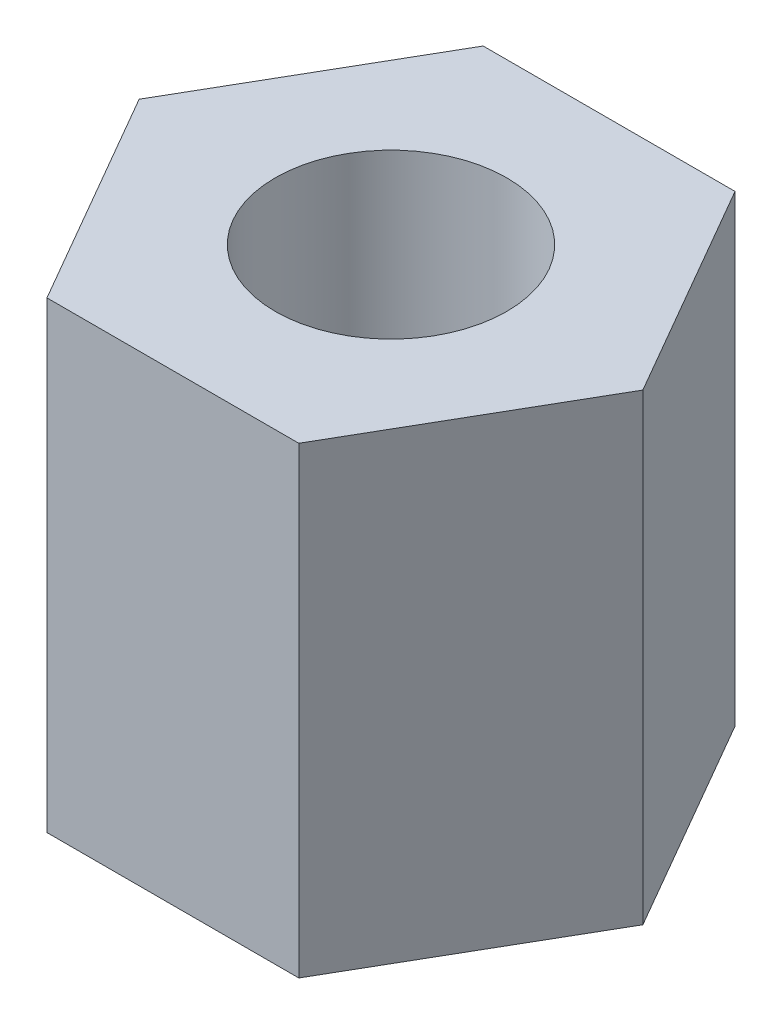
ISO-10303-21;
HEADER;
FILE_DESCRIPTION(('STEP AP214'),'2;1');
FILE_NAME('part.step','',(''),(''),'','','');
FILE_SCHEMA(('AUTOMOTIVE_DESIGN { 1 0 10303 214 1 1 1 1 }'));
ENDSEC;
DATA;
#1=APPLICATION_CONTEXT('core data for automotive mechanical design processes');
#2=APPLICATION_PROTOCOL_DEFINITION('international standard','automotive_design',2000,#1);
#3=PRODUCT_CONTEXT('',#1,'mechanical');
#4=PRODUCT('Part','Part','',(#3));
#5=PRODUCT_RELATED_PRODUCT_CATEGORY('part','',(#4));
#6=PRODUCT_DEFINITION_FORMATION('','',#4);
#7=PRODUCT_DEFINITION_CONTEXT('part definition',#1,'design');
#8=PRODUCT_DEFINITION('design','',#6,#7);
#9=PRODUCT_DEFINITION_SHAPE('','',#8);
#10=(LENGTH_UNIT() NAMED_UNIT(*) SI_UNIT(.MILLI.,.METRE.));
#11=(NAMED_UNIT(*) PLANE_ANGLE_UNIT() SI_UNIT($,.RADIAN.));
#12=(NAMED_UNIT(*) SI_UNIT($,.STERADIAN.) SOLID_ANGLE_UNIT());
#13=UNCERTAINTY_MEASURE_WITH_UNIT(LENGTH_MEASURE(1.E-05),#10,'distance_accuracy_value','');
#14=(GEOMETRIC_REPRESENTATION_CONTEXT(3) GLOBAL_UNCERTAINTY_ASSIGNED_CONTEXT((#13)) GLOBAL_UNIT_ASSIGNED_CONTEXT((#10,
#11,#12)) REPRESENTATION_CONTEXT('',''));
#15=CARTESIAN_POINT('',(0.,0.,0.));
#16=DIRECTION('',(0.,0.,1.));
#17=DIRECTION('',(1.,0.,0.));
#18=AXIS2_PLACEMENT_3D('',#15,#16,#17);
#19=CARTESIAN_POINT('',(1.3596598839416,5.,2.35499999999999));
#20=DIRECTION('',(-0.866025403784442,0.,-0.499999999999995));
#21=DIRECTION('',(-0.499999999999995,0.,0.866025403784442));
#22=AXIS2_PLACEMENT_3D('',#19,#20,#21);
#23=PLANE('',#22);
#24=DIRECTION('',(0.499999999999995,0.,-0.866025403784442));
#25=VECTOR('',#24,1.);
#26=CARTESIAN_POINT('',(1.3596598839416,0.,2.35499999999999));
#27=LINE('',#26,#25);
#28=CARTESIAN_POINT('',(1.3596598839416,0.,2.35499999999999));
#29=VERTEX_POINT('',#28);
#30=CARTESIAN_POINT('',(2.71931976788314,0.,0.));
#31=VERTEX_POINT('',#30);
#32=EDGE_CURVE('E130',#29,#31,#27,.T.);
#33=ORIENTED_EDGE('',*,*,#32,.T.);
#34=DIRECTION('',(0.,-1.,0.));
#35=VECTOR('',#34,1.);
#36=CARTESIAN_POINT('',(2.71931976788314,5.,0.));
#37=LINE('',#36,#35);
#38=CARTESIAN_POINT('',(2.71931976788314,5.,0.));
#39=VERTEX_POINT('',#38);
#40=EDGE_CURVE('E11',#39,#31,#37,.T.);
#41=ORIENTED_EDGE('',*,*,#40,.F.);
#42=DIRECTION('',(0.499999999999995,0.,-0.866025403784442));
#43=VECTOR('',#42,1.);
#44=CARTESIAN_POINT('',(1.3596598839416,5.,2.35499999999999));
#45=LINE('',#44,#43);
#46=CARTESIAN_POINT('',(1.3596598839416,5.,2.35499999999999));
#47=VERTEX_POINT('',#46);
#48=EDGE_CURVE('E147',#47,#39,#45,.T.);
#49=ORIENTED_EDGE('',*,*,#48,.F.);
#50=DIRECTION('',(0.,-1.,0.));
#51=VECTOR('',#50,1.);
#52=CARTESIAN_POINT('',(1.3596598839416,5.,2.35499999999999));
#53=LINE('',#52,#51);
#54=EDGE_CURVE('E126',#47,#29,#53,.T.);
#55=ORIENTED_EDGE('',*,*,#54,.T.);
#56=EDGE_LOOP('',(#33,#41,#49,#55));
#57=FACE_BOUND('',#56,.T.);
#58=ADVANCED_FACE('F41',(#57),#23,.F.);
#59=CARTESIAN_POINT('',(2.71931976788314,5.,0.));
#60=DIRECTION('',(-0.866025403784438,0.,0.500000000000001));
#61=DIRECTION('',(0.500000000000001,0.,0.866025403784438));
#62=AXIS2_PLACEMENT_3D('',#59,#60,#61);
#63=PLANE('',#62);
#64=DIRECTION('',(-0.500000000000001,0.,-0.866025403784438));
#65=VECTOR('',#64,1.);
#66=CARTESIAN_POINT('',(2.71931976788314,0.,0.));
#67=LINE('',#66,#65);
#68=CARTESIAN_POINT('',(1.35965988394156,0.,-2.355));
#69=VERTEX_POINT('',#68);
#70=EDGE_CURVE('E134',#31,#69,#67,.T.);
#71=ORIENTED_EDGE('',*,*,#70,.T.);
#72=DIRECTION('',(0.,-1.,0.));
#73=VECTOR('',#72,1.);
#74=CARTESIAN_POINT('',(1.35965988394156,5.,-2.355));
#75=LINE('',#74,#73);
#76=CARTESIAN_POINT('',(1.35965988394156,5.,-2.355));
#77=VERTEX_POINT('',#76);
#78=EDGE_CURVE('E50',#77,#69,#75,.T.);
#79=ORIENTED_EDGE('',*,*,#78,.F.);
#80=DIRECTION('',(-0.500000000000001,0.,-0.866025403784438));
#81=VECTOR('',#80,1.);
#82=CARTESIAN_POINT('',(2.71931976788314,5.,0.));
#83=LINE('',#82,#81);
#84=EDGE_CURVE('E95',#39,#77,#83,.T.);
#85=ORIENTED_EDGE('',*,*,#84,.F.);
#86=ORIENTED_EDGE('',*,*,#40,.T.);
#87=EDGE_LOOP('',(#71,#79,#85,#86));
#88=FACE_BOUND('',#87,.T.);
#89=ADVANCED_FACE('F176',(#88),#63,.F.);
#90=CARTESIAN_POINT('',(1.35965988394156,5.,-2.355));
#91=DIRECTION('',(0.,0.,1.));
#92=DIRECTION('',(1.,0.,0.));
#93=AXIS2_PLACEMENT_3D('',#90,#91,#92);
#94=PLANE('',#93);
#95=DIRECTION('',(-1.,0.,0.));
#96=VECTOR('',#95,1.);
#97=CARTESIAN_POINT('',(1.35965988394156,0.,-2.355));
#98=LINE('',#97,#96);
#99=CARTESIAN_POINT('',(-1.35965988394158,0.,-2.355));
#100=VERTEX_POINT('',#99);
#101=EDGE_CURVE('E138',#69,#100,#98,.T.);
#102=ORIENTED_EDGE('',*,*,#101,.T.);
#103=DIRECTION('',(0.,-1.,0.));
#104=VECTOR('',#103,1.);
#105=CARTESIAN_POINT('',(-1.35965988394158,5.,-2.355));
#106=LINE('',#105,#104);
#107=CARTESIAN_POINT('',(-1.35965988394158,5.,-2.355));
#108=VERTEX_POINT('',#107);
#109=EDGE_CURVE('E119',#108,#100,#106,.T.);
#110=ORIENTED_EDGE('',*,*,#109,.F.);
#111=DIRECTION('',(-1.,0.,0.));
#112=VECTOR('',#111,1.);
#113=CARTESIAN_POINT('',(1.35965988394156,5.,-2.355));
#114=LINE('',#113,#112);
#115=EDGE_CURVE('E108',#77,#108,#114,.T.);
#116=ORIENTED_EDGE('',*,*,#115,.F.);
#117=ORIENTED_EDGE('',*,*,#78,.T.);
#118=EDGE_LOOP('',(#102,#110,#116,#117));
#119=FACE_BOUND('',#118,.T.);
#120=ADVANCED_FACE('F157',(#119),#94,.F.);
#121=CARTESIAN_POINT('',(-1.35965988394158,5.,-2.355));
#122=DIRECTION('',(0.866025403784442,0.,0.499999999999995));
#123=DIRECTION('',(0.499999999999995,0.,-0.866025403784442));
#124=AXIS2_PLACEMENT_3D('',#121,#122,#123);
#125=PLANE('',#124);
#126=DIRECTION('',(-0.499999999999995,0.,0.866025403784442));
#127=VECTOR('',#126,1.);
#128=CARTESIAN_POINT('',(-1.35965988394158,0.,-2.355));
#129=LINE('',#128,#127);
#130=CARTESIAN_POINT('',(-2.71931976788314,0.,0.));
#131=VERTEX_POINT('',#130);
#132=EDGE_CURVE('E117',#100,#131,#129,.T.);
#133=ORIENTED_EDGE('',*,*,#132,.T.);
#134=DIRECTION('',(0.,-1.,0.));
#135=VECTOR('',#134,1.);
#136=CARTESIAN_POINT('',(-2.71931976788314,5.,0.));
#137=LINE('',#136,#135);
#138=CARTESIAN_POINT('',(-2.71931976788314,5.,0.));
#139=VERTEX_POINT('',#138);
#140=EDGE_CURVE('E114',#139,#131,#137,.T.);
#141=ORIENTED_EDGE('',*,*,#140,.F.);
#142=DIRECTION('',(-0.499999999999995,0.,0.866025403784442));
#143=VECTOR('',#142,1.);
#144=CARTESIAN_POINT('',(-1.35965988394158,5.,-2.355));
#145=LINE('',#144,#143);
#146=EDGE_CURVE('E102',#108,#139,#145,.T.);
#147=ORIENTED_EDGE('',*,*,#146,.F.);
#148=ORIENTED_EDGE('',*,*,#109,.T.);
#149=EDGE_LOOP('',(#133,#141,#147,#148));
#150=FACE_BOUND('',#149,.T.);
#151=ADVANCED_FACE('F115',(#150),#125,.F.);
#152=CARTESIAN_POINT('',(-2.71931976788314,5.,0.));
#153=DIRECTION('',(0.866025403784435,0.,-0.500000000000007));
#154=DIRECTION('',(-0.500000000000007,0.,-0.866025403784435));
#155=AXIS2_PLACEMENT_3D('',#152,#153,#154);
#156=PLANE('',#155);
#157=DIRECTION('',(0.500000000000007,0.,0.866025403784435));
#158=VECTOR('',#157,1.);
#159=CARTESIAN_POINT('',(-2.71931976788314,0.,0.));
#160=LINE('',#159,#158);
#161=CARTESIAN_POINT('',(-1.35965988394155,0.,2.35500000000001));
#162=VERTEX_POINT('',#161);
#163=EDGE_CURVE('E81',#131,#162,#160,.T.);
#164=ORIENTED_EDGE('',*,*,#163,.T.);
#165=DIRECTION('',(0.,-1.,0.));
#166=VECTOR('',#165,1.);
#167=CARTESIAN_POINT('',(-1.35965988394155,5.,2.35500000000001));
#168=LINE('',#167,#166);
#169=CARTESIAN_POINT('',(-1.35965988394155,5.,2.35500000000001));
#170=VERTEX_POINT('',#169);
#171=EDGE_CURVE('E120',#170,#162,#168,.T.);
#172=ORIENTED_EDGE('',*,*,#171,.F.);
#173=DIRECTION('',(0.500000000000007,0.,0.866025403784435));
#174=VECTOR('',#173,1.);
#175=CARTESIAN_POINT('',(-2.71931976788314,5.,0.));
#176=LINE('',#175,#174);
#177=EDGE_CURVE('E106',#139,#170,#176,.T.);
#178=ORIENTED_EDGE('',*,*,#177,.F.);
#179=ORIENTED_EDGE('',*,*,#140,.T.);
#180=EDGE_LOOP('',(#164,#172,#178,#179));
#181=FACE_BOUND('',#180,.T.);
#182=ADVANCED_FACE('F122',(#181),#156,.F.);
#183=CARTESIAN_POINT('',(-1.35965988394155,5.,2.35500000000001));
#184=DIRECTION('',(0.,0.,-1.));
#185=DIRECTION('',(-1.,0.,0.));
#186=AXIS2_PLACEMENT_3D('',#183,#184,#185);
#187=PLANE('',#186);
#188=DIRECTION('',(1.,0.,0.));
#189=VECTOR('',#188,1.);
#190=CARTESIAN_POINT('',(-1.35965988394155,0.,2.35500000000001));
#191=LINE('',#190,#189);
#192=EDGE_CURVE('E87',#162,#29,#191,.T.);
#193=ORIENTED_EDGE('',*,*,#192,.T.);
#194=ORIENTED_EDGE('',*,*,#54,.F.);
#195=DIRECTION('',(1.,0.,0.));
#196=VECTOR('',#195,1.);
#197=CARTESIAN_POINT('',(-1.35965988394155,5.,2.35500000000001));
#198=LINE('',#197,#196);
#199=EDGE_CURVE('E58',#170,#47,#198,.T.);
#200=ORIENTED_EDGE('',*,*,#199,.F.);
#201=ORIENTED_EDGE('',*,*,#171,.T.);
#202=EDGE_LOOP('',(#193,#194,#200,#201));
#203=FACE_BOUND('',#202,.T.);
#204=ADVANCED_FACE('F164',(#203),#187,.F.);
#205=CARTESIAN_POINT('',(0.,5.,0.));
#206=DIRECTION('',(0.,1.,0.));
#207=DIRECTION('',(0.,0.,1.));
#208=AXIS2_PLACEMENT_3D('',#205,#206,#207);
#209=PLANE('',#208);
#210=CARTESIAN_POINT('',(0.,5.,0.));
#211=DIRECTION('',(0.,1.,0.));
#212=DIRECTION('',(0.,0.,1.));
#213=AXIS2_PLACEMENT_3D('',#210,#211,#212);
#214=CIRCLE('',#213,1.24999999999999);
#215=CARTESIAN_POINT('',(0.,5.,1.24999999999999));
#216=VERTEX_POINT('',#215);
#217=EDGE_CURVE('E233',#216,#216,#214,.T.);
#218=ORIENTED_EDGE('',*,*,#217,.F.);
#219=EDGE_LOOP('',(#218));
#220=FACE_BOUND('',#219,.T.);
#221=ORIENTED_EDGE('',*,*,#48,.T.);
#222=ORIENTED_EDGE('',*,*,#84,.T.);
#223=ORIENTED_EDGE('',*,*,#115,.T.);
#224=ORIENTED_EDGE('',*,*,#146,.T.);
#225=ORIENTED_EDGE('',*,*,#177,.T.);
#226=ORIENTED_EDGE('',*,*,#199,.T.);
#227=EDGE_LOOP('',(#221,#222,#223,#224,#225,#226));
#228=FACE_BOUND('',#227,.T.);
#229=ADVANCED_FACE('F104',(#220,#228),#209,.T.);
#230=CARTESIAN_POINT('',(0.,0.,0.));
#231=DIRECTION('',(0.,1.,0.));
#232=DIRECTION('',(0.,0.,1.));
#233=AXIS2_PLACEMENT_3D('',#230,#231,#232);
#234=PLANE('',#233);
#235=CARTESIAN_POINT('',(0.,0.,0.));
#236=DIRECTION('',(0.,1.,0.));
#237=DIRECTION('',(0.,0.,1.));
#238=AXIS2_PLACEMENT_3D('',#235,#236,#237);
#239=CIRCLE('',#238,1.25);
#240=CARTESIAN_POINT('',(0.,0.,1.25));
#241=VERTEX_POINT('',#240);
#242=EDGE_CURVE('E135',#241,#241,#239,.T.);
#243=ORIENTED_EDGE('',*,*,#242,.T.);
#244=EDGE_LOOP('',(#243));
#245=FACE_BOUND('',#244,.T.);
#246=ORIENTED_EDGE('',*,*,#32,.F.);
#247=ORIENTED_EDGE('',*,*,#192,.F.);
#248=ORIENTED_EDGE('',*,*,#163,.F.);
#249=ORIENTED_EDGE('',*,*,#132,.F.);
#250=ORIENTED_EDGE('',*,*,#101,.F.);
#251=ORIENTED_EDGE('',*,*,#70,.F.);
#252=EDGE_LOOP('',(#246,#247,#248,#249,#250,#251));
#253=FACE_BOUND('',#252,.T.);
#254=ADVANCED_FACE('F160',(#245,#253),#234,.F.);
#255=CARTESIAN_POINT('',(0.,5.,0.));
#256=DIRECTION('',(0.,1.,0.));
#257=DIRECTION('',(0.,0.,1.));
#258=AXIS2_PLACEMENT_3D('',#255,#256,#257);
#259=CYLINDRICAL_SURFACE('',#258,1.24999999999999);
#260=ORIENTED_EDGE('',*,*,#242,.F.);
#261=EDGE_LOOP('',(#260));
#262=FACE_BOUND('',#261,.T.);
#263=ORIENTED_EDGE('',*,*,#217,.T.);
#264=EDGE_LOOP('',(#263));
#265=FACE_BOUND('',#264,.T.);
#266=ADVANCED_FACE('F213',(#262,#265),#259,.F.);
#267=CLOSED_SHELL('',(#58,#89,#120,#151,#182,#204,#229,#254,#266));
#268=MANIFOLD_SOLID_BREP('B2',#267);
#269=ADVANCED_BREP_SHAPE_REPRESENTATION('',(#18,#268),#14);
#270=SHAPE_DEFINITION_REPRESENTATION(#9,#269);
ENDSEC;
END-ISO-10303-21;
